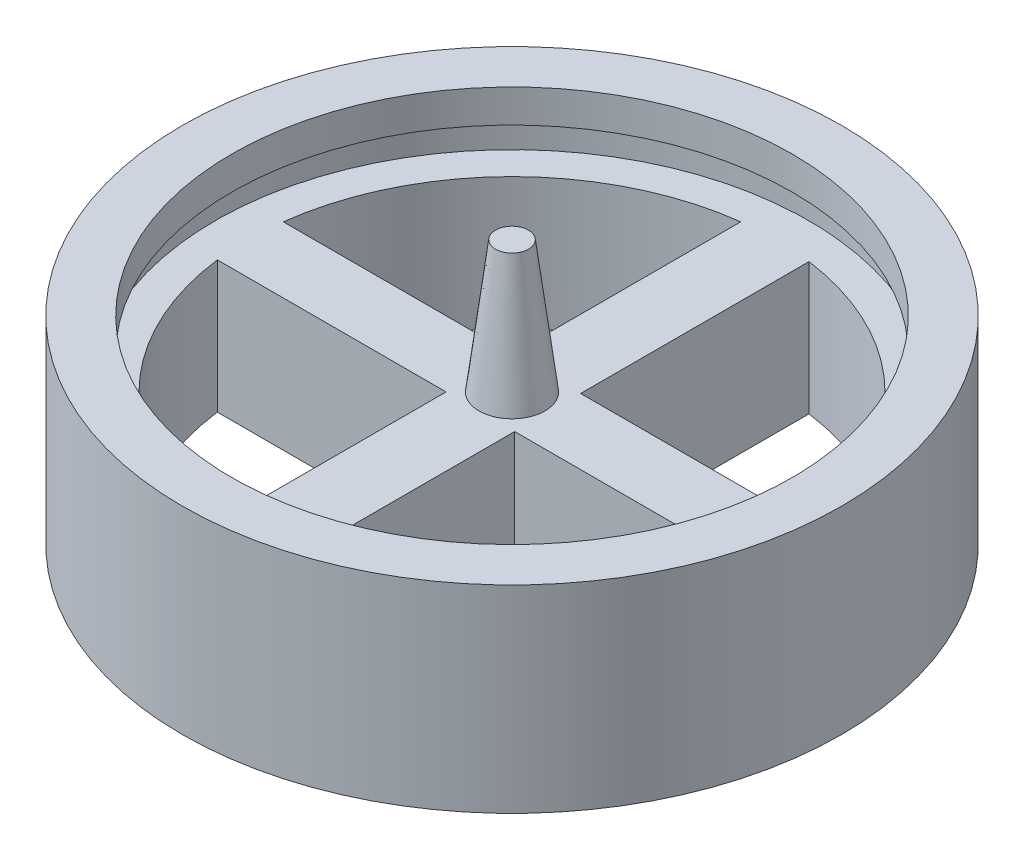
ISO-10303-21;
HEADER;
FILE_DESCRIPTION(('STEP AP214'),'2;1');
FILE_NAME('part.step','',(''),(''),'','','');
FILE_SCHEMA(('AUTOMOTIVE_DESIGN { 1 0 10303 214 1 1 1 1 }'));
ENDSEC;
DATA;
#1=APPLICATION_CONTEXT('core data for automotive mechanical design processes');
#2=APPLICATION_PROTOCOL_DEFINITION('international standard','automotive_design',2000,#1);
#3=PRODUCT_CONTEXT('',#1,'mechanical');
#4=PRODUCT('Part','Part','',(#3));
#5=PRODUCT_RELATED_PRODUCT_CATEGORY('part','',(#4));
#6=PRODUCT_DEFINITION_FORMATION('','',#4);
#7=PRODUCT_DEFINITION_CONTEXT('part definition',#1,'design');
#8=PRODUCT_DEFINITION('design','',#6,#7);
#9=PRODUCT_DEFINITION_SHAPE('','',#8);
#10=(LENGTH_UNIT() NAMED_UNIT(*) SI_UNIT(.MILLI.,.METRE.));
#11=(NAMED_UNIT(*) PLANE_ANGLE_UNIT() SI_UNIT($,.RADIAN.));
#12=(NAMED_UNIT(*) SI_UNIT($,.STERADIAN.) SOLID_ANGLE_UNIT());
#13=UNCERTAINTY_MEASURE_WITH_UNIT(LENGTH_MEASURE(1.E-05),#10,'distance_accuracy_value','');
#14=(GEOMETRIC_REPRESENTATION_CONTEXT(3) GLOBAL_UNCERTAINTY_ASSIGNED_CONTEXT((#13)) GLOBAL_UNIT_ASSIGNED_CONTEXT((#10,
#11,#12)) REPRESENTATION_CONTEXT('',''));
#15=CARTESIAN_POINT('',(0.,0.,0.));
#16=DIRECTION('',(0.,0.,1.));
#17=DIRECTION('',(1.,0.,0.));
#18=AXIS2_PLACEMENT_3D('',#15,#16,#17);
#19=CARTESIAN_POINT('',(0.,0.,-0.499999999994089));
#20=DIRECTION('',(0.,0.,1.));
#21=DIRECTION('',(1.,0.,0.));
#22=AXIS2_PLACEMENT_3D('',#19,#20,#21);
#23=PLANE('',#22);
#24=DIRECTION('',(-1.,0.,0.));
#25=VECTOR('',#24,1.);
#26=CARTESIAN_POINT('',(0.,2.,-0.499999999994089));
#27=LINE('',#26,#25);
#28=CARTESIAN_POINT('',(3.96862696659763,2.,-0.499999999994088));
#29=VERTEX_POINT('',#28);
#30=CARTESIAN_POINT('',(0.540748653393555,2.,-0.499999999994089));
#31=VERTEX_POINT('',#30);
#32=EDGE_CURVE('E192',#29,#31,#27,.T.);
#33=ORIENTED_EDGE('',*,*,#32,.F.);
#34=DIRECTION('',(0.,1.,0.));
#35=VECTOR('',#34,1.);
#36=CARTESIAN_POINT('',(3.96862696659763,0.,-0.499999999994088));
#37=LINE('',#36,#35);
#38=CARTESIAN_POINT('',(3.96862696659763,0.,-0.499999999994088));
#39=VERTEX_POINT('',#38);
#40=EDGE_CURVE('E164',#39,#29,#37,.T.);
#41=ORIENTED_EDGE('',*,*,#40,.F.);
#42=DIRECTION('',(1.,0.,0.));
#43=VECTOR('',#42,1.);
#44=CARTESIAN_POINT('',(0.,0.,-0.499999999994089));
#45=LINE('',#44,#43);
#46=CARTESIAN_POINT('',(0.540748653393555,0.,-0.499999999994089));
#47=VERTEX_POINT('',#46);
#48=EDGE_CURVE('E154',#47,#39,#45,.T.);
#49=ORIENTED_EDGE('',*,*,#48,.F.);
#50=DIRECTION('',(0.,1.,0.));
#51=VECTOR('',#50,1.);
#52=CARTESIAN_POINT('',(0.540748653393555,0.,-0.499999999994089));
#53=LINE('',#52,#51);
#54=EDGE_CURVE('E165',#47,#31,#53,.T.);
#55=ORIENTED_EDGE('',*,*,#54,.T.);
#56=EDGE_LOOP('',(#33,#41,#49,#55));
#57=FACE_BOUND('',#56,.T.);
#58=ADVANCED_FACE('F37',(#57),#23,.F.);
#59=CARTESIAN_POINT('',(0.540748653393555,0.,0.));
#60=DIRECTION('',(-1.,0.,0.));
#61=DIRECTION('',(0.,0.,1.));
#62=AXIS2_PLACEMENT_3D('',#59,#60,#61);
#63=PLANE('',#62);
#64=DIRECTION('',(0.,0.,-1.));
#65=VECTOR('',#64,1.);
#66=CARTESIAN_POINT('',(0.540748653393555,2.,0.));
#67=LINE('',#66,#65);
#68=CARTESIAN_POINT('',(0.540748653393555,2.,-3.96328031986801));
#69=VERTEX_POINT('',#68);
#70=EDGE_CURVE('E52',#31,#69,#67,.T.);
#71=ORIENTED_EDGE('',*,*,#70,.F.);
#72=ORIENTED_EDGE('',*,*,#54,.F.);
#73=DIRECTION('',(0.,0.,1.));
#74=VECTOR('',#73,1.);
#75=CARTESIAN_POINT('',(0.540748653393555,0.,0.));
#76=LINE('',#75,#74);
#77=CARTESIAN_POINT('',(0.540748653393555,0.,-3.96328031986801));
#78=VERTEX_POINT('',#77);
#79=EDGE_CURVE('E161',#78,#47,#76,.T.);
#80=ORIENTED_EDGE('',*,*,#79,.F.);
#81=DIRECTION('',(0.,1.,0.));
#82=VECTOR('',#81,1.);
#83=CARTESIAN_POINT('',(0.540748653393555,0.,-3.96328031986801));
#84=LINE('',#83,#82);
#85=EDGE_CURVE('E169',#78,#69,#84,.T.);
#86=ORIENTED_EDGE('',*,*,#85,.T.);
#87=EDGE_LOOP('',(#71,#72,#80,#86));
#88=FACE_BOUND('',#87,.T.);
#89=ADVANCED_FACE('F271',(#88),#63,.F.);
#90=CARTESIAN_POINT('',(0.,0.,0.));
#91=DIRECTION('',(0.,1.,0.));
#92=DIRECTION('',(0.,0.,1.));
#93=AXIS2_PLACEMENT_3D('',#90,#91,#92);
#94=CYLINDRICAL_SURFACE('',#93,4.);
#95=CARTESIAN_POINT('',(0.,2.,0.));
#96=DIRECTION('',(0.,1.,0.));
#97=DIRECTION('',(0.,0.,1.));
#98=AXIS2_PLACEMENT_3D('',#95,#96,#97);
#99=CIRCLE('',#98,4.);
#100=EDGE_CURVE('E239',#69,#29,#99,.F.);
#101=ORIENTED_EDGE('',*,*,#100,.F.);
#102=ORIENTED_EDGE('',*,*,#85,.F.);
#103=CARTESIAN_POINT('',(0.,0.,0.));
#104=DIRECTION('',(0.,1.,0.));
#105=DIRECTION('',(0.,0.,1.));
#106=AXIS2_PLACEMENT_3D('',#103,#104,#105);
#107=CIRCLE('',#106,4.);
#108=EDGE_CURVE('E157',#39,#78,#107,.T.);
#109=ORIENTED_EDGE('',*,*,#108,.F.);
#110=ORIENTED_EDGE('',*,*,#40,.T.);
#111=EDGE_LOOP('',(#101,#102,#109,#110));
#112=FACE_BOUND('',#111,.T.);
#113=ADVANCED_FACE('F267',(#112),#94,.F.);
#114=CARTESIAN_POINT('',(-0.499999999999999,0.,0.));
#115=DIRECTION('',(-1.,0.,0.));
#116=DIRECTION('',(0.,0.,1.));
#117=AXIS2_PLACEMENT_3D('',#114,#115,#116);
#118=PLANE('',#117);
#119=DIRECTION('',(0.,1.,0.));
#120=VECTOR('',#119,1.);
#121=CARTESIAN_POINT('',(-0.499999999999999,0.,-0.499999999994088));
#122=LINE('',#121,#120);
#123=CARTESIAN_POINT('',(-0.499999999999999,0.,-0.499999999994088));
#124=VERTEX_POINT('',#123);
#125=CARTESIAN_POINT('',(-0.499999999999999,2.,-0.499999999994088));
#126=VERTEX_POINT('',#125);
#127=EDGE_CURVE('E158',#124,#126,#122,.T.);
#128=ORIENTED_EDGE('',*,*,#127,.T.);
#129=DIRECTION('',(0.,0.,-1.));
#130=VECTOR('',#129,1.);
#131=CARTESIAN_POINT('',(-0.499999999999999,2.,0.));
#132=LINE('',#131,#130);
#133=CARTESIAN_POINT('',(-0.5,2.,-3.96862696659689));
#134=VERTEX_POINT('',#133);
#135=EDGE_CURVE('E236',#126,#134,#132,.T.);
#136=ORIENTED_EDGE('',*,*,#135,.T.);
#137=DIRECTION('',(0.,1.,0.));
#138=VECTOR('',#137,1.);
#139=CARTESIAN_POINT('',(-0.5,0.,-3.96862696659689));
#140=LINE('',#139,#138);
#141=CARTESIAN_POINT('',(-0.5,0.,-3.96862696659689));
#142=VERTEX_POINT('',#141);
#143=EDGE_CURVE('E210',#142,#134,#140,.T.);
#144=ORIENTED_EDGE('',*,*,#143,.F.);
#145=DIRECTION('',(0.,0.,1.));
#146=VECTOR('',#145,1.);
#147=CARTESIAN_POINT('',(-0.499999999999999,0.,0.));
#148=LINE('',#147,#146);
#149=EDGE_CURVE('E189',#142,#124,#148,.T.);
#150=ORIENTED_EDGE('',*,*,#149,.T.);
#151=EDGE_LOOP('',(#128,#136,#144,#150));
#152=FACE_BOUND('',#151,.T.);
#153=ADVANCED_FACE('F257',(#152),#118,.T.);
#154=CARTESIAN_POINT('',(0.,0.,-0.499999999994088));
#155=DIRECTION('',(0.,0.,-1.));
#156=DIRECTION('',(-1.,0.,0.));
#157=AXIS2_PLACEMENT_3D('',#154,#155,#156);
#158=PLANE('',#157);
#159=DIRECTION('',(0.,1.,0.));
#160=VECTOR('',#159,1.);
#161=CARTESIAN_POINT('',(-3.96862696659763,0.,-0.499999999994088));
#162=LINE('',#161,#160);
#163=CARTESIAN_POINT('',(-3.96862696659763,0.,-0.499999999994088));
#164=VERTEX_POINT('',#163);
#165=CARTESIAN_POINT('',(-3.96862696659763,2.,-0.499999999994088));
#166=VERTEX_POINT('',#165);
#167=EDGE_CURVE('E249',#164,#166,#162,.T.);
#168=ORIENTED_EDGE('',*,*,#167,.T.);
#169=DIRECTION('',(1.,0.,0.));
#170=VECTOR('',#169,1.);
#171=CARTESIAN_POINT('',(0.,2.,-0.499999999994088));
#172=LINE('',#171,#170);
#173=EDGE_CURVE('E60',#166,#126,#172,.T.);
#174=ORIENTED_EDGE('',*,*,#173,.T.);
#175=ORIENTED_EDGE('',*,*,#127,.F.);
#176=DIRECTION('',(-1.,0.,0.));
#177=VECTOR('',#176,1.);
#178=CARTESIAN_POINT('',(0.,0.,-0.499999999994088));
#179=LINE('',#178,#177);
#180=EDGE_CURVE('E245',#124,#164,#179,.T.);
#181=ORIENTED_EDGE('',*,*,#180,.T.);
#182=EDGE_LOOP('',(#168,#174,#175,#181));
#183=FACE_BOUND('',#182,.T.);
#184=ADVANCED_FACE('F259',(#183),#158,.T.);
#185=CARTESIAN_POINT('',(0.,0.,0.));
#186=DIRECTION('',(0.,1.,0.));
#187=DIRECTION('',(0.,0.,1.));
#188=AXIS2_PLACEMENT_3D('',#185,#186,#187);
#189=CYLINDRICAL_SURFACE('',#188,4.);
#190=CARTESIAN_POINT('',(0.,2.,0.));
#191=DIRECTION('',(0.,1.,0.));
#192=DIRECTION('',(0.,0.,1.));
#193=AXIS2_PLACEMENT_3D('',#190,#191,#192);
#194=CIRCLE('',#193,4.);
#195=EDGE_CURVE('E228',#166,#134,#194,.F.);
#196=ORIENTED_EDGE('',*,*,#195,.F.);
#197=ORIENTED_EDGE('',*,*,#167,.F.);
#198=CARTESIAN_POINT('',(0.,0.,0.));
#199=DIRECTION('',(0.,1.,0.));
#200=DIRECTION('',(0.,0.,1.));
#201=AXIS2_PLACEMENT_3D('',#198,#199,#200);
#202=CIRCLE('',#201,4.);
#203=EDGE_CURVE('E243',#142,#164,#202,.T.);
#204=ORIENTED_EDGE('',*,*,#203,.F.);
#205=ORIENTED_EDGE('',*,*,#143,.T.);
#206=EDGE_LOOP('',(#196,#197,#204,#205));
#207=FACE_BOUND('',#206,.T.);
#208=ADVANCED_FACE('F255',(#207),#189,.F.);
#209=CARTESIAN_POINT('',(0.,0.,0.5));
#210=DIRECTION('',(0.,0.,1.));
#211=DIRECTION('',(1.,0.,0.));
#212=AXIS2_PLACEMENT_3D('',#209,#210,#211);
#213=PLANE('',#212);
#214=DIRECTION('',(0.,1.,0.));
#215=VECTOR('',#214,1.);
#216=CARTESIAN_POINT('',(-0.5,0.,0.5));
#217=LINE('',#216,#215);
#218=CARTESIAN_POINT('',(-0.5,0.,0.5));
#219=VERTEX_POINT('',#218);
#220=CARTESIAN_POINT('',(-0.5,2.,0.5));
#221=VERTEX_POINT('',#220);
#222=EDGE_CURVE('E215',#219,#221,#217,.T.);
#223=ORIENTED_EDGE('',*,*,#222,.T.);
#224=DIRECTION('',(-1.,0.,0.));
#225=VECTOR('',#224,1.);
#226=CARTESIAN_POINT('',(0.,2.,0.5));
#227=LINE('',#226,#225);
#228=CARTESIAN_POINT('',(-3.96862696659689,2.,0.5));
#229=VERTEX_POINT('',#228);
#230=EDGE_CURVE('E227',#221,#229,#227,.T.);
#231=ORIENTED_EDGE('',*,*,#230,.T.);
#232=DIRECTION('',(0.,1.,0.));
#233=VECTOR('',#232,1.);
#234=CARTESIAN_POINT('',(-3.96862696659689,0.,0.5));
#235=LINE('',#234,#233);
#236=CARTESIAN_POINT('',(-3.96862696659689,0.,0.5));
#237=VERTEX_POINT('',#236);
#238=EDGE_CURVE('E197',#237,#229,#235,.T.);
#239=ORIENTED_EDGE('',*,*,#238,.F.);
#240=DIRECTION('',(1.,0.,0.));
#241=VECTOR('',#240,1.);
#242=CARTESIAN_POINT('',(0.,0.,0.5));
#243=LINE('',#242,#241);
#244=EDGE_CURVE('E199',#237,#219,#243,.T.);
#245=ORIENTED_EDGE('',*,*,#244,.T.);
#246=EDGE_LOOP('',(#223,#231,#239,#245));
#247=FACE_BOUND('',#246,.T.);
#248=ADVANCED_FACE('F226',(#247),#213,.T.);
#249=CARTESIAN_POINT('',(-0.499999999999999,0.,0.));
#250=DIRECTION('',(-1.,0.,0.));
#251=DIRECTION('',(0.,0.,1.));
#252=AXIS2_PLACEMENT_3D('',#249,#250,#251);
#253=PLANE('',#252);
#254=DIRECTION('',(0.,1.,0.));
#255=VECTOR('',#254,1.);
#256=CARTESIAN_POINT('',(-0.5,0.,3.96862696659689));
#257=LINE('',#256,#255);
#258=CARTESIAN_POINT('',(-0.5,0.,3.96862696659689));
#259=VERTEX_POINT('',#258);
#260=CARTESIAN_POINT('',(-0.5,2.,3.96862696659689));
#261=VERTEX_POINT('',#260);
#262=EDGE_CURVE('E216',#259,#261,#257,.T.);
#263=ORIENTED_EDGE('',*,*,#262,.T.);
#264=DIRECTION('',(0.,0.,-1.));
#265=VECTOR('',#264,1.);
#266=CARTESIAN_POINT('',(-0.499999999999999,2.,0.));
#267=LINE('',#266,#265);
#268=EDGE_CURVE('E229',#261,#221,#267,.T.);
#269=ORIENTED_EDGE('',*,*,#268,.T.);
#270=ORIENTED_EDGE('',*,*,#222,.F.);
#271=DIRECTION('',(0.,0.,1.));
#272=VECTOR('',#271,1.);
#273=CARTESIAN_POINT('',(-0.499999999999999,0.,0.));
#274=LINE('',#273,#272);
#275=EDGE_CURVE('E207',#219,#259,#274,.T.);
#276=ORIENTED_EDGE('',*,*,#275,.T.);
#277=EDGE_LOOP('',(#263,#269,#270,#276));
#278=FACE_BOUND('',#277,.T.);
#279=ADVANCED_FACE('F312',(#278),#253,.T.);
#280=CARTESIAN_POINT('',(0.,0.,0.));
#281=DIRECTION('',(0.,1.,0.));
#282=DIRECTION('',(0.,0.,1.));
#283=AXIS2_PLACEMENT_3D('',#280,#281,#282);
#284=CYLINDRICAL_SURFACE('',#283,4.);
#285=CARTESIAN_POINT('',(0.,2.,0.));
#286=DIRECTION('',(0.,1.,0.));
#287=DIRECTION('',(0.,0.,1.));
#288=AXIS2_PLACEMENT_3D('',#285,#286,#287);
#289=CIRCLE('',#288,4.);
#290=EDGE_CURVE('E140',#261,#229,#289,.F.);
#291=ORIENTED_EDGE('',*,*,#290,.F.);
#292=ORIENTED_EDGE('',*,*,#262,.F.);
#293=CARTESIAN_POINT('',(0.,0.,0.));
#294=DIRECTION('',(0.,1.,0.));
#295=DIRECTION('',(0.,0.,1.));
#296=AXIS2_PLACEMENT_3D('',#293,#294,#295);
#297=CIRCLE('',#296,4.);
#298=EDGE_CURVE('E200',#237,#259,#297,.T.);
#299=ORIENTED_EDGE('',*,*,#298,.F.);
#300=ORIENTED_EDGE('',*,*,#238,.T.);
#301=EDGE_LOOP('',(#291,#292,#299,#300));
#302=FACE_BOUND('',#301,.T.);
#303=ADVANCED_FACE('F224',(#302),#284,.F.);
#304=CARTESIAN_POINT('',(0.540748653393555,0.,0.));
#305=DIRECTION('',(1.,0.,0.));
#306=DIRECTION('',(0.,0.,-1.));
#307=AXIS2_PLACEMENT_3D('',#304,#305,#306);
#308=PLANE('',#307);
#309=DIRECTION('',(0.,1.,0.));
#310=VECTOR('',#309,1.);
#311=CARTESIAN_POINT('',(0.540748653393555,0.,0.5));
#312=LINE('',#311,#310);
#313=CARTESIAN_POINT('',(0.540748653393555,0.,0.5));
#314=VERTEX_POINT('',#313);
#315=CARTESIAN_POINT('',(0.540748653393555,2.,0.5));
#316=VERTEX_POINT('',#315);
#317=EDGE_CURVE('E139',#314,#316,#312,.T.);
#318=ORIENTED_EDGE('',*,*,#317,.T.);
#319=DIRECTION('',(0.,0.,1.));
#320=VECTOR('',#319,1.);
#321=CARTESIAN_POINT('',(0.540748653393555,2.,0.));
#322=LINE('',#321,#320);
#323=CARTESIAN_POINT('',(0.540748653393555,2.,3.96328031986801));
#324=VERTEX_POINT('',#323);
#325=EDGE_CURVE('E127',#316,#324,#322,.T.);
#326=ORIENTED_EDGE('',*,*,#325,.T.);
#327=DIRECTION('',(0.,1.,0.));
#328=VECTOR('',#327,1.);
#329=CARTESIAN_POINT('',(0.540748653393555,0.,3.96328031986801));
#330=LINE('',#329,#328);
#331=CARTESIAN_POINT('',(0.540748653393555,0.,3.96328031986801));
#332=VERTEX_POINT('',#331);
#333=EDGE_CURVE('E136',#332,#324,#330,.T.);
#334=ORIENTED_EDGE('',*,*,#333,.F.);
#335=DIRECTION('',(0.,0.,-1.));
#336=VECTOR('',#335,1.);
#337=CARTESIAN_POINT('',(0.540748653393555,0.,0.));
#338=LINE('',#337,#336);
#339=EDGE_CURVE('E191',#332,#314,#338,.T.);
#340=ORIENTED_EDGE('',*,*,#339,.T.);
#341=EDGE_LOOP('',(#318,#326,#334,#340));
#342=FACE_BOUND('',#341,.T.);
#343=ADVANCED_FACE('F135',(#342),#308,.T.);
#344=CARTESIAN_POINT('',(0.,0.,0.5));
#345=DIRECTION('',(0.,0.,1.));
#346=DIRECTION('',(1.,0.,0.));
#347=AXIS2_PLACEMENT_3D('',#344,#345,#346);
#348=PLANE('',#347);
#349=DIRECTION('',(0.,1.,0.));
#350=VECTOR('',#349,1.);
#351=CARTESIAN_POINT('',(3.96862696659689,0.,0.5));
#352=LINE('',#351,#350);
#353=CARTESIAN_POINT('',(3.96862696659689,0.,0.5));
#354=VERTEX_POINT('',#353);
#355=CARTESIAN_POINT('',(3.96862696659689,2.,0.5));
#356=VERTEX_POINT('',#355);
#357=EDGE_CURVE('E146',#354,#356,#352,.T.);
#358=ORIENTED_EDGE('',*,*,#357,.T.);
#359=DIRECTION('',(-1.,0.,0.));
#360=VECTOR('',#359,1.);
#361=CARTESIAN_POINT('',(0.,2.,0.5));
#362=LINE('',#361,#360);
#363=EDGE_CURVE('E129',#356,#316,#362,.T.);
#364=ORIENTED_EDGE('',*,*,#363,.T.);
#365=ORIENTED_EDGE('',*,*,#317,.F.);
#366=DIRECTION('',(1.,0.,0.));
#367=VECTOR('',#366,1.);
#368=CARTESIAN_POINT('',(0.,0.,0.5));
#369=LINE('',#368,#367);
#370=EDGE_CURVE('E147',#314,#354,#369,.T.);
#371=ORIENTED_EDGE('',*,*,#370,.T.);
#372=EDGE_LOOP('',(#358,#364,#365,#371));
#373=FACE_BOUND('',#372,.T.);
#374=ADVANCED_FACE('F287',(#373),#348,.T.);
#375=CARTESIAN_POINT('',(0.,0.,0.));
#376=DIRECTION('',(0.,1.,0.));
#377=DIRECTION('',(0.,0.,1.));
#378=AXIS2_PLACEMENT_3D('',#375,#376,#377);
#379=CYLINDRICAL_SURFACE('',#378,4.);
#380=CARTESIAN_POINT('',(0.,2.,0.));
#381=DIRECTION('',(0.,1.,0.));
#382=DIRECTION('',(0.,0.,1.));
#383=AXIS2_PLACEMENT_3D('',#380,#381,#382);
#384=CIRCLE('',#383,4.);
#385=EDGE_CURVE('E11',#356,#324,#384,.F.);
#386=ORIENTED_EDGE('',*,*,#385,.F.);
#387=ORIENTED_EDGE('',*,*,#357,.F.);
#388=CARTESIAN_POINT('',(0.,0.,0.));
#389=DIRECTION('',(0.,1.,0.));
#390=DIRECTION('',(0.,0.,1.));
#391=AXIS2_PLACEMENT_3D('',#388,#389,#390);
#392=CIRCLE('',#391,4.);
#393=EDGE_CURVE('E144',#332,#354,#392,.T.);
#394=ORIENTED_EDGE('',*,*,#393,.F.);
#395=ORIENTED_EDGE('',*,*,#333,.T.);
#396=EDGE_LOOP('',(#386,#387,#394,#395));
#397=FACE_BOUND('',#396,.T.);
#398=ADVANCED_FACE('F142',(#397),#379,.F.);
#399=CARTESIAN_POINT('',(0.,3.,0.));
#400=DIRECTION('',(0.,1.,0.));
#401=DIRECTION('',(0.,0.,1.));
#402=AXIS2_PLACEMENT_3D('',#399,#400,#401);
#403=PLANE('',#402);
#404=CARTESIAN_POINT('',(0.,3.,0.));
#405=DIRECTION('',(0.,1.,0.));
#406=DIRECTION('',(0.,0.,1.));
#407=AXIS2_PLACEMENT_3D('',#404,#405,#406);
#408=CIRCLE('',#407,5.);
#409=CARTESIAN_POINT('',(0.,3.,5.));
#410=VERTEX_POINT('',#409);
#411=EDGE_CURVE('E45',#410,#410,#408,.T.);
#412=ORIENTED_EDGE('',*,*,#411,.T.);
#413=EDGE_LOOP('',(#412));
#414=FACE_BOUND('',#413,.T.);
#415=CARTESIAN_POINT('',(0.,3.,0.));
#416=DIRECTION('',(0.,-1.,0.));
#417=DIRECTION('',(0.,0.,-1.));
#418=AXIS2_PLACEMENT_3D('',#415,#416,#417);
#419=CIRCLE('',#418,4.25);
#420=CARTESIAN_POINT('',(0.,3.,-4.25));
#421=VERTEX_POINT('',#420);
#422=EDGE_CURVE('E293',#421,#421,#419,.T.);
#423=ORIENTED_EDGE('',*,*,#422,.T.);
#424=EDGE_LOOP('',(#423));
#425=FACE_BOUND('',#424,.T.);
#426=ADVANCED_FACE('F182',(#414,#425),#403,.T.);
#427=CARTESIAN_POINT('',(0.,0.,0.));
#428=DIRECTION('',(0.,1.,0.));
#429=DIRECTION('',(0.,0.,1.));
#430=AXIS2_PLACEMENT_3D('',#427,#428,#429);
#431=PLANE('',#430);
#432=ORIENTED_EDGE('',*,*,#244,.F.);
#433=ORIENTED_EDGE('',*,*,#298,.T.);
#434=ORIENTED_EDGE('',*,*,#275,.F.);
#435=EDGE_LOOP('',(#432,#433,#434));
#436=FACE_BOUND('',#435,.T.);
#437=CARTESIAN_POINT('',(0.,0.,0.));
#438=DIRECTION('',(0.,1.,0.));
#439=DIRECTION('',(0.,0.,1.));
#440=AXIS2_PLACEMENT_3D('',#437,#438,#439);
#441=CIRCLE('',#440,5.);
#442=CARTESIAN_POINT('',(0.,0.,5.));
#443=VERTEX_POINT('',#442);
#444=EDGE_CURVE('E168',#443,#443,#441,.T.);
#445=ORIENTED_EDGE('',*,*,#444,.F.);
#446=EDGE_LOOP('',(#445));
#447=FACE_BOUND('',#446,.T.);
#448=ORIENTED_EDGE('',*,*,#79,.T.);
#449=ORIENTED_EDGE('',*,*,#48,.T.);
#450=ORIENTED_EDGE('',*,*,#108,.T.);
#451=EDGE_LOOP('',(#448,#449,#450));
#452=FACE_BOUND('',#451,.T.);
#453=ORIENTED_EDGE('',*,*,#149,.F.);
#454=ORIENTED_EDGE('',*,*,#203,.T.);
#455=ORIENTED_EDGE('',*,*,#180,.F.);
#456=EDGE_LOOP('',(#453,#454,#455));
#457=FACE_BOUND('',#456,.T.);
#458=ORIENTED_EDGE('',*,*,#339,.F.);
#459=ORIENTED_EDGE('',*,*,#393,.T.);
#460=ORIENTED_EDGE('',*,*,#370,.F.);
#461=EDGE_LOOP('',(#458,#459,#460));
#462=FACE_BOUND('',#461,.T.);
#463=ADVANCED_FACE('F179',(#436,#447,#452,#457,#462),#431,.F.);
#464=CARTESIAN_POINT('',(0.,3.,0.));
#465=DIRECTION('',(0.,-1.,0.));
#466=DIRECTION('',(0.,0.,-1.));
#467=AXIS2_PLACEMENT_3D('',#464,#465,#466);
#468=CYLINDRICAL_SURFACE('',#467,5.);
#469=ORIENTED_EDGE('',*,*,#411,.F.);
#470=EDGE_LOOP('',(#469));
#471=FACE_BOUND('',#470,.T.);
#472=ORIENTED_EDGE('',*,*,#444,.T.);
#473=EDGE_LOOP('',(#472));
#474=FACE_BOUND('',#473,.T.);
#475=ADVANCED_FACE('F39',(#471,#474),#468,.T.);
#476=CARTESIAN_POINT('',(0.,2.,0.));
#477=DIRECTION('',(0.,1.,0.));
#478=DIRECTION('',(0.,0.,1.));
#479=AXIS2_PLACEMENT_3D('',#476,#477,#478);
#480=PLANE('',#479);
#481=CARTESIAN_POINT('',(0.,2.,0.));
#482=DIRECTION('',(0.,-1.,0.));
#483=DIRECTION('',(0.,0.,-1.));
#484=AXIS2_PLACEMENT_3D('',#481,#482,#483);
#485=CIRCLE('',#484,0.5);
#486=CARTESIAN_POINT('',(0.,2.,-0.5));
#487=VERTEX_POINT('',#486);
#488=EDGE_CURVE('E303',#487,#487,#485,.T.);
#489=ORIENTED_EDGE('',*,*,#488,.T.);
#490=EDGE_LOOP('',(#489));
#491=FACE_BOUND('',#490,.T.);
#492=CARTESIAN_POINT('',(0.,2.,0.));
#493=DIRECTION('',(0.,1.,0.));
#494=DIRECTION('',(0.,0.,1.));
#495=AXIS2_PLACEMENT_3D('',#492,#493,#494);
#496=CIRCLE('',#495,4.5);
#497=CARTESIAN_POINT('',(0.,2.,4.5));
#498=VERTEX_POINT('',#497);
#499=EDGE_CURVE('E309',#498,#498,#496,.T.);
#500=ORIENTED_EDGE('',*,*,#499,.T.);
#501=EDGE_LOOP('',(#500));
#502=FACE_BOUND('',#501,.T.);
#503=ORIENTED_EDGE('',*,*,#363,.F.);
#504=ORIENTED_EDGE('',*,*,#385,.T.);
#505=ORIENTED_EDGE('',*,*,#325,.F.);
#506=EDGE_LOOP('',(#503,#504,#505));
#507=FACE_BOUND('',#506,.T.);
#508=ORIENTED_EDGE('',*,*,#268,.F.);
#509=ORIENTED_EDGE('',*,*,#290,.T.);
#510=ORIENTED_EDGE('',*,*,#230,.F.);
#511=EDGE_LOOP('',(#508,#509,#510));
#512=FACE_BOUND('',#511,.T.);
#513=ORIENTED_EDGE('',*,*,#173,.F.);
#514=ORIENTED_EDGE('',*,*,#195,.T.);
#515=ORIENTED_EDGE('',*,*,#135,.F.);
#516=EDGE_LOOP('',(#513,#514,#515));
#517=FACE_BOUND('',#516,.T.);
#518=ORIENTED_EDGE('',*,*,#32,.T.);
#519=ORIENTED_EDGE('',*,*,#70,.T.);
#520=ORIENTED_EDGE('',*,*,#100,.T.);
#521=EDGE_LOOP('',(#518,#519,#520));
#522=FACE_BOUND('',#521,.T.);
#523=ADVANCED_FACE('F125',(#491,#502,#507,#512,#517,#522),#480,.T.);
#524=CARTESIAN_POINT('',(0.,2.,0.));
#525=DIRECTION('',(0.,1.,0.));
#526=DIRECTION('',(0.,0.,1.));
#527=AXIS2_PLACEMENT_3D('',#524,#525,#526);
#528=CYLINDRICAL_SURFACE('',#527,4.5);
#529=CARTESIAN_POINT('',(0.,2.5,0.));
#530=DIRECTION('',(0.,-1.,0.));
#531=DIRECTION('',(0.,0.,-1.));
#532=AXIS2_PLACEMENT_3D('',#529,#530,#531);
#533=CIRCLE('',#532,4.5);
#534=CARTESIAN_POINT('',(0.,2.5,-4.5));
#535=VERTEX_POINT('',#534);
#536=EDGE_CURVE('E298',#535,#535,#533,.T.);
#537=ORIENTED_EDGE('',*,*,#536,.F.);
#538=EDGE_LOOP('',(#537));
#539=FACE_BOUND('',#538,.T.);
#540=ORIENTED_EDGE('',*,*,#499,.F.);
#541=EDGE_LOOP('',(#540));
#542=FACE_BOUND('',#541,.T.);
#543=ADVANCED_FACE('F349',(#539,#542),#528,.F.);
#544=CARTESIAN_POINT('',(0.,4.,0.));
#545=DIRECTION('',(0.,-1.,0.));
#546=DIRECTION('',(0.,0.,-1.));
#547=AXIS2_PLACEMENT_3D('',#544,#545,#546);
#548=PLANE('',#547);
#549=CARTESIAN_POINT('',(0.,4.,0.));
#550=DIRECTION('',(0.,-1.,0.));
#551=DIRECTION('',(0.,0.,-1.));
#552=AXIS2_PLACEMENT_3D('',#549,#550,#551);
#553=CIRCLE('',#552,0.25);
#554=CARTESIAN_POINT('',(0.,4.,-0.25));
#555=VERTEX_POINT('',#554);
#556=EDGE_CURVE('E306',#555,#555,#553,.T.);
#557=ORIENTED_EDGE('',*,*,#556,.F.);
#558=EDGE_LOOP('',(#557));
#559=FACE_BOUND('',#558,.T.);
#560=ADVANCED_FACE('F359',(#559),#548,.F.);
#561=CARTESIAN_POINT('',(0.,4.,0.));
#562=DIRECTION('',(0.,-1.,0.));
#563=DIRECTION('',(0.,0.,-1.));
#564=AXIS2_PLACEMENT_3D('',#561,#562,#563);
#565=CONICAL_SURFACE('',#564,0.25,0.124354994546761);
#566=ORIENTED_EDGE('',*,*,#488,.F.);
#567=EDGE_LOOP('',(#566));
#568=FACE_BOUND('',#567,.T.);
#569=ORIENTED_EDGE('',*,*,#556,.T.);
#570=EDGE_LOOP('',(#569));
#571=FACE_BOUND('',#570,.T.);
#572=ADVANCED_FACE('F364',(#568,#571),#565,.T.);
#573=CARTESIAN_POINT('',(0.,2.5,0.));
#574=DIRECTION('',(0.,-1.,0.));
#575=DIRECTION('',(0.,0.,-1.));
#576=AXIS2_PLACEMENT_3D('',#573,#574,#575);
#577=PLANE('',#576);
#578=ORIENTED_EDGE('',*,*,#536,.T.);
#579=EDGE_LOOP('',(#578));
#580=FACE_BOUND('',#579,.T.);
#581=CARTESIAN_POINT('',(0.,2.5,0.));
#582=DIRECTION('',(0.,-1.,0.));
#583=DIRECTION('',(0.,0.,-1.));
#584=AXIS2_PLACEMENT_3D('',#581,#582,#583);
#585=CIRCLE('',#584,4.25);
#586=CARTESIAN_POINT('',(0.,2.5,-4.25));
#587=VERTEX_POINT('',#586);
#588=EDGE_CURVE('E295',#587,#587,#585,.T.);
#589=ORIENTED_EDGE('',*,*,#588,.F.);
#590=EDGE_LOOP('',(#589));
#591=FACE_BOUND('',#590,.T.);
#592=ADVANCED_FACE('F373',(#580,#591),#577,.T.);
#593=CARTESIAN_POINT('',(0.,2.,0.));
#594=DIRECTION('',(0.,-1.,0.));
#595=DIRECTION('',(0.,0.,-1.));
#596=AXIS2_PLACEMENT_3D('',#593,#594,#595);
#597=CYLINDRICAL_SURFACE('',#596,4.25);
#598=ORIENTED_EDGE('',*,*,#588,.T.);
#599=EDGE_LOOP('',(#598));
#600=FACE_BOUND('',#599,.T.);
#601=ORIENTED_EDGE('',*,*,#422,.F.);
#602=EDGE_LOOP('',(#601));
#603=FACE_BOUND('',#602,.T.);
#604=ADVANCED_FACE('F395',(#600,#603),#597,.F.);
#605=CLOSED_SHELL('',(#58,#89,#113,#153,#184,#208,#248,#279,#303,#343,#374,#398,#426,#463,#475,
#523,#543,#560,#572,#592,#604));
#606=MANIFOLD_SOLID_BREP('B2',#605);
#607=ADVANCED_BREP_SHAPE_REPRESENTATION('',(#18,#606),#14);
#608=SHAPE_DEFINITION_REPRESENTATION(#9,#607);
ENDSEC;
END-ISO-10303-21;
